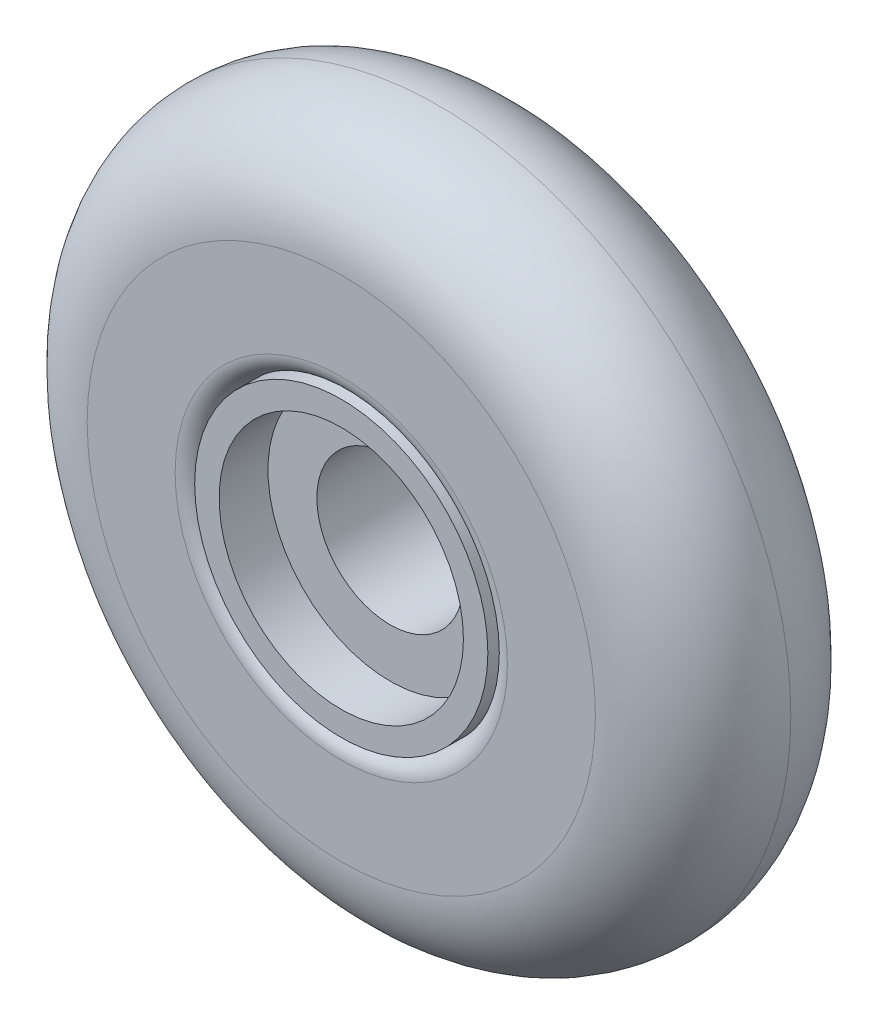
ISO-10303-21;
HEADER;
FILE_DESCRIPTION(('STEP AP214'),'2;1');
FILE_NAME('part.step','',(''),(''),'','','');
FILE_SCHEMA(('AUTOMOTIVE_DESIGN { 1 0 10303 214 1 1 1 1 }'));
ENDSEC;
DATA;
#1=APPLICATION_CONTEXT('core data for automotive mechanical design processes');
#2=APPLICATION_PROTOCOL_DEFINITION('international standard','automotive_design',2000,#1);
#3=PRODUCT_CONTEXT('',#1,'mechanical');
#4=PRODUCT('Part','Part','',(#3));
#5=PRODUCT_RELATED_PRODUCT_CATEGORY('part','',(#4));
#6=PRODUCT_DEFINITION_FORMATION('','',#4);
#7=PRODUCT_DEFINITION_CONTEXT('part definition',#1,'design');
#8=PRODUCT_DEFINITION('design','',#6,#7);
#9=PRODUCT_DEFINITION_SHAPE('','',#8);
#10=(LENGTH_UNIT() NAMED_UNIT(*) SI_UNIT(.MILLI.,.METRE.));
#11=(NAMED_UNIT(*) PLANE_ANGLE_UNIT() SI_UNIT($,.RADIAN.));
#12=(NAMED_UNIT(*) SI_UNIT($,.STERADIAN.) SOLID_ANGLE_UNIT());
#13=UNCERTAINTY_MEASURE_WITH_UNIT(LENGTH_MEASURE(1.E-05),#10,'distance_accuracy_value','');
#14=(GEOMETRIC_REPRESENTATION_CONTEXT(3) GLOBAL_UNCERTAINTY_ASSIGNED_CONTEXT((#13)) GLOBAL_UNIT_ASSIGNED_CONTEXT((#10,
#11,#12)) REPRESENTATION_CONTEXT('',''));
#15=CARTESIAN_POINT('',(0.,0.,0.));
#16=DIRECTION('',(0.,0.,1.));
#17=DIRECTION('',(1.,0.,0.));
#18=AXIS2_PLACEMENT_3D('',#15,#16,#17);
#19=CARTESIAN_POINT('',(-38.2056660012815,40.177716156197,284.478449624226));
#20=DIRECTION('',(0.,0.,-1.));
#21=DIRECTION('',(-1.,0.,0.));
#22=AXIS2_PLACEMENT_3D('',#19,#20,#21);
#23=PLANE('',#22);
#24=CARTESIAN_POINT('',(-38.2056660012815,40.177716156197,284.478449624226));
#25=DIRECTION('',(0.,0.,-1.));
#26=DIRECTION('',(-1.,0.,0.));
#27=AXIS2_PLACEMENT_3D('',#24,#25,#26);
#28=CIRCLE('',#27,17.);
#29=CARTESIAN_POINT('',(-55.2056660012815,40.177716156197,284.478449624226));
#30=VERTEX_POINT('',#29);
#31=EDGE_CURVE('P0_E22',#30,#30,#28,.F.);
#32=ORIENTED_EDGE('',*,*,#31,.T.);
#33=EDGE_LOOP('',(#32));
#34=FACE_BOUND('',#33,.T.);
#35=CARTESIAN_POINT('',(-38.2056660012815,40.177716156197,284.478449624226));
#36=DIRECTION('',(0.,0.,-1.));
#37=DIRECTION('',(-1.,0.,0.));
#38=AXIS2_PLACEMENT_3D('',#35,#36,#37);
#39=CIRCLE('',#38,26.);
#40=CARTESIAN_POINT('',(-64.2056660012815,40.177716156197,284.478449624226));
#41=VERTEX_POINT('',#40);
#42=EDGE_CURVE('P0_E33',#41,#41,#39,.T.);
#43=ORIENTED_EDGE('',*,*,#42,.T.);
#44=EDGE_LOOP('',(#43));
#45=FACE_BOUND('',#44,.T.);
#46=ADVANCED_FACE('P0_F14',(#34,#45),#23,.T.);
#47=CARTESIAN_POINT('',(-38.2056660012814,40.177716156197,304.478449624226));
#48=DIRECTION('',(0.,0.,-1.));
#49=DIRECTION('',(-1.,0.,0.));
#50=AXIS2_PLACEMENT_3D('',#47,#48,#49);
#51=PLANE('',#50);
#52=CARTESIAN_POINT('',(-38.2056660012814,40.177716156197,304.478449624226));
#53=DIRECTION('',(0.,0.,-1.));
#54=DIRECTION('',(-1.,0.,0.));
#55=AXIS2_PLACEMENT_3D('',#52,#53,#54);
#56=CIRCLE('',#55,17.);
#57=CARTESIAN_POINT('',(-55.2056660012815,40.177716156197,304.478449624226));
#58=VERTEX_POINT('',#57);
#59=EDGE_CURVE('P0_E10',#58,#58,#56,.T.);
#60=ORIENTED_EDGE('',*,*,#59,.T.);
#61=EDGE_LOOP('',(#60));
#62=FACE_BOUND('',#61,.T.);
#63=CARTESIAN_POINT('',(-38.2056660012814,40.177716156197,304.478449624226));
#64=DIRECTION('',(0.,0.,-1.));
#65=DIRECTION('',(-1.,0.,0.));
#66=AXIS2_PLACEMENT_3D('',#63,#64,#65);
#67=CIRCLE('',#66,26.);
#68=CARTESIAN_POINT('',(-64.2056660012814,40.177716156197,304.478449624226));
#69=VERTEX_POINT('',#68);
#70=EDGE_CURVE('P0_E28',#69,#69,#67,.F.);
#71=ORIENTED_EDGE('',*,*,#70,.T.);
#72=EDGE_LOOP('',(#71));
#73=FACE_BOUND('',#72,.T.);
#74=ADVANCED_FACE('P0_F82',(#62,#73),#51,.F.);
#75=CARTESIAN_POINT('',(-38.2056660012815,40.177716156197,294.478449624226));
#76=DIRECTION('',(0.,0.,-1.));
#77=DIRECTION('',(-1.,0.,0.));
#78=AXIS2_PLACEMENT_3D('',#75,#76,#77);
#79=TOROIDAL_SURFACE('',#78,26.,10.);
#80=ORIENTED_EDGE('',*,*,#70,.F.);
#81=EDGE_LOOP('',(#80));
#82=FACE_BOUND('',#81,.T.);
#83=CARTESIAN_POINT('',(-38.2056660012815,40.177716156197,294.478449624226));
#84=DIRECTION('',(0.,0.,-1.));
#85=DIRECTION('',(-1.,0.,0.));
#86=AXIS2_PLACEMENT_3D('',#83,#84,#85);
#87=CIRCLE('',#86,36.);
#88=CARTESIAN_POINT('',(-74.2056660012815,40.177716156197,294.478449624226));
#89=VERTEX_POINT('',#88);
#90=EDGE_CURVE('P0_E36',#89,#89,#87,.T.);
#91=ORIENTED_EDGE('',*,*,#90,.F.);
#92=EDGE_LOOP('',(#91));
#93=FACE_BOUND('',#92,.T.);
#94=ADVANCED_FACE('P0_F87',(#82,#93),#79,.T.);
#95=CARTESIAN_POINT('',(-38.2056660012815,40.177716156197,294.478449624226));
#96=DIRECTION('',(0.,0.,-1.));
#97=DIRECTION('',(-1.,0.,0.));
#98=AXIS2_PLACEMENT_3D('',#95,#96,#97);
#99=TOROIDAL_SURFACE('',#98,26.,10.);
#100=ORIENTED_EDGE('',*,*,#90,.T.);
#101=EDGE_LOOP('',(#100));
#102=FACE_BOUND('',#101,.T.);
#103=ORIENTED_EDGE('',*,*,#42,.F.);
#104=EDGE_LOOP('',(#103));
#105=FACE_BOUND('',#104,.T.);
#106=ADVANCED_FACE('P0_F93',(#102,#105),#99,.T.);
#107=CARTESIAN_POINT('',(-38.2056660012815,40.177716156197,286.478449624226));
#108=DIRECTION('',(0.,0.,-1.));
#109=DIRECTION('',(-1.,0.,0.));
#110=AXIS2_PLACEMENT_3D('',#107,#108,#109);
#111=TOROIDAL_SURFACE('',#110,17.,2.);
#112=ORIENTED_EDGE('',*,*,#31,.F.);
#113=EDGE_LOOP('',(#112));
#114=FACE_BOUND('',#113,.T.);
#115=CARTESIAN_POINT('',(-38.2056660012815,40.177716156197,286.478449624226));
#116=DIRECTION('',(0.,0.,-1.));
#117=DIRECTION('',(-1.,0.,0.));
#118=AXIS2_PLACEMENT_3D('',#115,#116,#117);
#119=CIRCLE('',#118,15.);
#120=CARTESIAN_POINT('',(-53.2056660012815,40.177716156197,286.478449624226));
#121=VERTEX_POINT('',#120);
#122=EDGE_CURVE('P0_E39',#121,#121,#119,.T.);
#123=ORIENTED_EDGE('',*,*,#122,.F.);
#124=EDGE_LOOP('',(#123));
#125=FACE_BOUND('',#124,.T.);
#126=ADVANCED_FACE('P0_F79',(#114,#125),#111,.T.);
#127=CARTESIAN_POINT('',(-38.2056660012814,40.177716156197,302.478449624226));
#128=DIRECTION('',(0.,0.,-1.));
#129=DIRECTION('',(-1.,0.,0.));
#130=AXIS2_PLACEMENT_3D('',#127,#128,#129);
#131=TOROIDAL_SURFACE('',#130,17.,2.);
#132=CARTESIAN_POINT('',(-38.2056660012814,40.177716156197,302.478449624226));
#133=DIRECTION('',(0.,0.,-1.));
#134=DIRECTION('',(-1.,0.,0.));
#135=AXIS2_PLACEMENT_3D('',#132,#133,#134);
#136=CIRCLE('',#135,15.);
#137=CARTESIAN_POINT('',(-53.2056660012814,40.177716156197,302.478449624226));
#138=VERTEX_POINT('',#137);
#139=EDGE_CURVE('P0_E44',#138,#138,#136,.T.);
#140=ORIENTED_EDGE('',*,*,#139,.T.);
#141=EDGE_LOOP('',(#140));
#142=FACE_BOUND('',#141,.T.);
#143=ORIENTED_EDGE('',*,*,#59,.F.);
#144=EDGE_LOOP('',(#143));
#145=FACE_BOUND('',#144,.T.);
#146=ADVANCED_FACE('P0_F16',(#142,#145),#131,.T.);
#147=CARTESIAN_POINT('',(-38.2056660012815,40.177716156197,286.478449624226));
#148=DIRECTION('',(0.,0.,-1.));
#149=DIRECTION('',(-1.,0.,0.));
#150=AXIS2_PLACEMENT_3D('',#147,#148,#149);
#151=PLANE('',#150);
#152=ORIENTED_EDGE('',*,*,#122,.T.);
#153=EDGE_LOOP('',(#152));
#154=FACE_BOUND('',#153,.T.);
#155=CARTESIAN_POINT('',(-38.2056660012815,40.177716156197,286.478449624226));
#156=DIRECTION('',(0.,0.,-1.));
#157=DIRECTION('',(-1.,0.,0.));
#158=AXIS2_PLACEMENT_3D('',#155,#156,#157);
#159=CIRCLE('',#158,26.);
#160=CARTESIAN_POINT('',(-64.2056660012815,40.177716156197,286.478449624226));
#161=VERTEX_POINT('',#160);
#162=EDGE_CURVE('P0_E55',#161,#161,#159,.T.);
#163=ORIENTED_EDGE('',*,*,#162,.F.);
#164=EDGE_LOOP('',(#163));
#165=FACE_BOUND('',#164,.T.);
#166=ADVANCED_FACE('P0_F66',(#154,#165),#151,.F.);
#167=CARTESIAN_POINT('',(-38.2056660012814,40.177716156197,302.478449624226));
#168=DIRECTION('',(0.,0.,-1.));
#169=DIRECTION('',(-1.,0.,0.));
#170=AXIS2_PLACEMENT_3D('',#167,#168,#169);
#171=PLANE('',#170);
#172=ORIENTED_EDGE('',*,*,#139,.F.);
#173=EDGE_LOOP('',(#172));
#174=FACE_BOUND('',#173,.T.);
#175=CARTESIAN_POINT('',(-38.2056660012814,40.177716156197,302.478449624226));
#176=DIRECTION('',(0.,0.,-1.));
#177=DIRECTION('',(-1.,0.,0.));
#178=AXIS2_PLACEMENT_3D('',#175,#176,#177);
#179=CIRCLE('',#178,26.);
#180=CARTESIAN_POINT('',(-64.2056660012814,40.177716156197,302.478449624226));
#181=VERTEX_POINT('',#180);
#182=EDGE_CURVE('P0_E48',#181,#181,#179,.F.);
#183=ORIENTED_EDGE('',*,*,#182,.F.);
#184=EDGE_LOOP('',(#183));
#185=FACE_BOUND('',#184,.T.);
#186=ADVANCED_FACE('P0_F68',(#174,#185),#171,.T.);
#187=CARTESIAN_POINT('',(-38.2056660012815,40.177716156197,294.478449624226));
#188=DIRECTION('',(0.,0.,-1.));
#189=DIRECTION('',(-1.,0.,0.));
#190=AXIS2_PLACEMENT_3D('',#187,#188,#189);
#191=TOROIDAL_SURFACE('',#190,26.,8.);
#192=ORIENTED_EDGE('',*,*,#182,.T.);
#193=EDGE_LOOP('',(#192));
#194=FACE_BOUND('',#193,.T.);
#195=CARTESIAN_POINT('',(-38.2056660012815,40.177716156197,294.478449624226));
#196=DIRECTION('',(0.,0.,-1.));
#197=DIRECTION('',(-1.,0.,0.));
#198=AXIS2_PLACEMENT_3D('',#195,#196,#197);
#199=CIRCLE('',#198,34.);
#200=CARTESIAN_POINT('',(-72.2056660012815,40.177716156197,294.478449624226));
#201=VERTEX_POINT('',#200);
#202=EDGE_CURVE('P0_E56',#201,#201,#199,.T.);
#203=ORIENTED_EDGE('',*,*,#202,.T.);
#204=EDGE_LOOP('',(#203));
#205=FACE_BOUND('',#204,.T.);
#206=ADVANCED_FACE('P0_F76',(#194,#205),#191,.F.);
#207=CARTESIAN_POINT('',(-38.2056660012815,40.177716156197,294.478449624226));
#208=DIRECTION('',(0.,0.,-1.));
#209=DIRECTION('',(-1.,0.,0.));
#210=AXIS2_PLACEMENT_3D('',#207,#208,#209);
#211=TOROIDAL_SURFACE('',#210,26.,8.);
#212=ORIENTED_EDGE('',*,*,#202,.F.);
#213=EDGE_LOOP('',(#212));
#214=FACE_BOUND('',#213,.T.);
#215=ORIENTED_EDGE('',*,*,#162,.T.);
#216=EDGE_LOOP('',(#215));
#217=FACE_BOUND('',#216,.T.);
#218=ADVANCED_FACE('P0_F64',(#214,#217),#211,.F.);
#219=CLOSED_SHELL('',(#46,#74,#94,#106,#126,#146,#166,#186,#206,#218));
#220=MANIFOLD_SOLID_BREP('P0_B1',#219);
#221=CARTESIAN_POINT('',(-38.2056660012814,40.177716156197,304.478449624226));
#222=DIRECTION('',(0.,0.,-1.));
#223=DIRECTION('',(-1.,0.,0.));
#224=AXIS2_PLACEMENT_3D('',#221,#222,#223);
#225=CYLINDRICAL_SURFACE('',#224,15.);
#226=CARTESIAN_POINT('',(-38.2056660012814,40.177716156197,304.478449624226));
#227=DIRECTION('',(0.,0.,-1.));
#228=DIRECTION('',(-1.,0.,0.));
#229=AXIS2_PLACEMENT_3D('',#226,#227,#228);
#230=CIRCLE('',#229,15.);
#231=CARTESIAN_POINT('',(-53.2056660012814,40.177716156197,304.478449624226));
#232=VERTEX_POINT('',#231);
#233=EDGE_CURVE('P1_E10',#232,#232,#230,.T.);
#234=ORIENTED_EDGE('',*,*,#233,.T.);
#235=EDGE_LOOP('',(#234));
#236=FACE_BOUND('',#235,.T.);
#237=CARTESIAN_POINT('',(-38.2056660012815,40.177716156197,284.478449624226));
#238=DIRECTION('',(0.,0.,-1.));
#239=DIRECTION('',(-1.,0.,0.));
#240=AXIS2_PLACEMENT_3D('',#237,#238,#239);
#241=CIRCLE('',#240,15.);
#242=CARTESIAN_POINT('',(-53.2056660012815,40.177716156197,284.478449624226));
#243=VERTEX_POINT('',#242);
#244=EDGE_CURVE('P1_E17',#243,#243,#241,.T.);
#245=ORIENTED_EDGE('',*,*,#244,.F.);
#246=EDGE_LOOP('',(#245));
#247=FACE_BOUND('',#246,.T.);
#248=ADVANCED_FACE('P1_F14',(#236,#247),#225,.T.);
#249=CARTESIAN_POINT('',(-38.2056660012814,40.177716156197,304.478449624226));
#250=DIRECTION('',(0.,0.,-1.));
#251=DIRECTION('',(-1.,0.,0.));
#252=AXIS2_PLACEMENT_3D('',#249,#250,#251);
#253=PLANE('',#252);
#254=CARTESIAN_POINT('',(-38.2056660012814,40.177716156197,304.478449624226));
#255=DIRECTION('',(0.,0.,1.));
#256=DIRECTION('',(1.,0.,0.));
#257=AXIS2_PLACEMENT_3D('',#254,#255,#256);
#258=CIRCLE('',#257,12.5);
#259=CARTESIAN_POINT('',(-25.7056660012814,40.177716156197,304.478449624226));
#260=VERTEX_POINT('',#259);
#261=EDGE_CURVE('P1_E26',#260,#260,#258,.T.);
#262=ORIENTED_EDGE('',*,*,#261,.F.);
#263=EDGE_LOOP('',(#262));
#264=FACE_BOUND('',#263,.T.);
#265=ORIENTED_EDGE('',*,*,#233,.F.);
#266=EDGE_LOOP('',(#265));
#267=FACE_BOUND('',#266,.T.);
#268=ADVANCED_FACE('P1_F63',(#264,#267),#253,.F.);
#269=CARTESIAN_POINT('',(-38.2056660012815,40.177716156197,284.478449624226));
#270=DIRECTION('',(0.,0.,-1.));
#271=DIRECTION('',(-1.,0.,0.));
#272=AXIS2_PLACEMENT_3D('',#269,#270,#271);
#273=PLANE('',#272);
#274=CARTESIAN_POINT('',(-38.2056660012815,40.177716156197,284.478449624226));
#275=DIRECTION('',(0.,0.,-1.));
#276=DIRECTION('',(-1.,0.,0.));
#277=AXIS2_PLACEMENT_3D('',#274,#275,#276);
#278=CIRCLE('',#277,12.5);
#279=CARTESIAN_POINT('',(-50.7056660012815,40.177716156197,284.478449624226));
#280=VERTEX_POINT('',#279);
#281=EDGE_CURVE('P1_E32',#280,#280,#278,.T.);
#282=ORIENTED_EDGE('',*,*,#281,.F.);
#283=EDGE_LOOP('',(#282));
#284=FACE_BOUND('',#283,.T.);
#285=ORIENTED_EDGE('',*,*,#244,.T.);
#286=EDGE_LOOP('',(#285));
#287=FACE_BOUND('',#286,.T.);
#288=ADVANCED_FACE('P1_F59',(#284,#287),#273,.T.);
#289=CARTESIAN_POINT('',(-38.2056660012815,40.177716156197,299.478449624226));
#290=DIRECTION('',(0.,0.,1.));
#291=DIRECTION('',(1.,0.,0.));
#292=AXIS2_PLACEMENT_3D('',#289,#290,#291);
#293=CYLINDRICAL_SURFACE('',#292,12.5);
#294=CARTESIAN_POINT('',(-38.2056660012815,40.177716156197,299.478449624226));
#295=DIRECTION('',(0.,0.,1.));
#296=DIRECTION('',(1.,0.,0.));
#297=AXIS2_PLACEMENT_3D('',#294,#295,#296);
#298=CIRCLE('',#297,12.5);
#299=CARTESIAN_POINT('',(-25.7056660012815,40.177716156197,299.478449624226));
#300=VERTEX_POINT('',#299);
#301=EDGE_CURVE('P1_E24',#300,#300,#298,.T.);
#302=ORIENTED_EDGE('',*,*,#301,.F.);
#303=EDGE_LOOP('',(#302));
#304=FACE_BOUND('',#303,.T.);
#305=ORIENTED_EDGE('',*,*,#261,.T.);
#306=EDGE_LOOP('',(#305));
#307=FACE_BOUND('',#306,.T.);
#308=ADVANCED_FACE('P1_F62',(#304,#307),#293,.F.);
#309=CARTESIAN_POINT('',(-38.2056660012815,40.177716156197,299.478449624226));
#310=DIRECTION('',(0.,0.,1.));
#311=DIRECTION('',(1.,0.,0.));
#312=AXIS2_PLACEMENT_3D('',#309,#310,#311);
#313=PLANE('',#312);
#314=CARTESIAN_POINT('',(-38.2056660012815,40.177716156197,299.478449624226));
#315=DIRECTION('',(0.,0.,1.));
#316=DIRECTION('',(1.,0.,0.));
#317=AXIS2_PLACEMENT_3D('',#314,#315,#316);
#318=CIRCLE('',#317,7.5);
#319=CARTESIAN_POINT('',(-30.7056660012815,40.177716156197,299.478449624226));
#320=VERTEX_POINT('',#319);
#321=EDGE_CURVE('P1_E35',#320,#320,#318,.T.);
#322=ORIENTED_EDGE('',*,*,#321,.F.);
#323=EDGE_LOOP('',(#322));
#324=FACE_BOUND('',#323,.T.);
#325=ORIENTED_EDGE('',*,*,#301,.T.);
#326=EDGE_LOOP('',(#325));
#327=FACE_BOUND('',#326,.T.);
#328=ADVANCED_FACE('P1_F55',(#324,#327),#313,.T.);
#329=CARTESIAN_POINT('',(-38.2056660012815,40.177716156197,289.478449624226));
#330=DIRECTION('',(0.,0.,-1.));
#331=DIRECTION('',(-1.,0.,0.));
#332=AXIS2_PLACEMENT_3D('',#329,#330,#331);
#333=CYLINDRICAL_SURFACE('',#332,12.5);
#334=CARTESIAN_POINT('',(-38.2056660012815,40.177716156197,289.478449624226));
#335=DIRECTION('',(0.,0.,-1.));
#336=DIRECTION('',(-1.,0.,0.));
#337=AXIS2_PLACEMENT_3D('',#334,#335,#336);
#338=CIRCLE('',#337,12.5);
#339=CARTESIAN_POINT('',(-50.7056660012815,40.177716156197,289.478449624226));
#340=VERTEX_POINT('',#339);
#341=EDGE_CURVE('P1_E29',#340,#340,#338,.T.);
#342=ORIENTED_EDGE('',*,*,#341,.F.);
#343=EDGE_LOOP('',(#342));
#344=FACE_BOUND('',#343,.T.);
#345=ORIENTED_EDGE('',*,*,#281,.T.);
#346=EDGE_LOOP('',(#345));
#347=FACE_BOUND('',#346,.T.);
#348=ADVANCED_FACE('P1_F49',(#344,#347),#333,.F.);
#349=CARTESIAN_POINT('',(-38.2056660012815,40.177716156197,289.478449624226));
#350=DIRECTION('',(0.,0.,-1.));
#351=DIRECTION('',(-1.,0.,0.));
#352=AXIS2_PLACEMENT_3D('',#349,#350,#351);
#353=PLANE('',#352);
#354=CARTESIAN_POINT('',(-38.2056660012815,40.177716156197,289.478449624226));
#355=DIRECTION('',(0.,0.,-1.));
#356=DIRECTION('',(-1.,0.,0.));
#357=AXIS2_PLACEMENT_3D('',#354,#355,#356);
#358=CIRCLE('',#357,7.5);
#359=CARTESIAN_POINT('',(-45.7056660012815,40.177716156197,289.478449624226));
#360=VERTEX_POINT('',#359);
#361=EDGE_CURVE('P1_E40',#360,#360,#358,.T.);
#362=ORIENTED_EDGE('',*,*,#361,.F.);
#363=EDGE_LOOP('',(#362));
#364=FACE_BOUND('',#363,.T.);
#365=ORIENTED_EDGE('',*,*,#341,.T.);
#366=EDGE_LOOP('',(#365));
#367=FACE_BOUND('',#366,.T.);
#368=ADVANCED_FACE('P1_F46',(#364,#367),#353,.T.);
#369=CARTESIAN_POINT('',(-38.2056660012814,40.177716156197,304.478449624226));
#370=DIRECTION('',(0.,0.,-1.));
#371=DIRECTION('',(-1.,0.,0.));
#372=AXIS2_PLACEMENT_3D('',#369,#370,#371);
#373=CYLINDRICAL_SURFACE('',#372,7.5);
#374=ORIENTED_EDGE('',*,*,#321,.T.);
#375=EDGE_LOOP('',(#374));
#376=FACE_BOUND('',#375,.T.);
#377=ORIENTED_EDGE('',*,*,#361,.T.);
#378=EDGE_LOOP('',(#377));
#379=FACE_BOUND('',#378,.T.);
#380=ADVANCED_FACE('P1_F44',(#376,#379),#373,.F.);
#381=CLOSED_SHELL('',(#248,#268,#288,#308,#328,#348,#368,#380));
#382=MANIFOLD_SOLID_BREP('P1_B1',#381);
#383=ADVANCED_BREP_SHAPE_REPRESENTATION('',(#18,#220,#382),#14);
#384=SHAPE_DEFINITION_REPRESENTATION(#9,#383);
ENDSEC;
END-ISO-10303-21;
